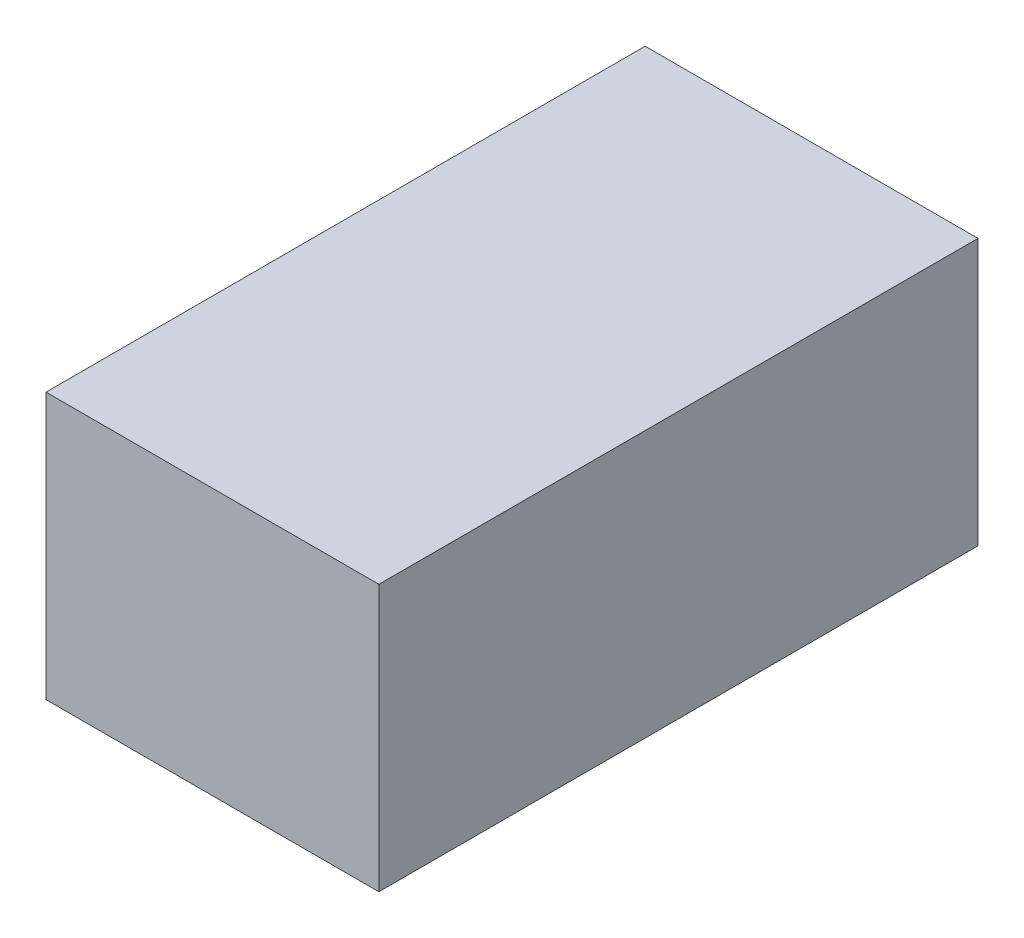
ISO-10303-21;
HEADER;
FILE_DESCRIPTION(('STEP AP214'),'2;1');
FILE_NAME('part.step','',(''),(''),'','','');
FILE_SCHEMA(('AUTOMOTIVE_DESIGN { 1 0 10303 214 1 1 1 1 }'));
ENDSEC;
DATA;
#1=APPLICATION_CONTEXT('core data for automotive mechanical design processes');
#2=APPLICATION_PROTOCOL_DEFINITION('international standard','automotive_design',2000,#1);
#3=PRODUCT_CONTEXT('',#1,'mechanical');
#4=PRODUCT('Part','Part','',(#3));
#5=PRODUCT_RELATED_PRODUCT_CATEGORY('part','',(#4));
#6=PRODUCT_DEFINITION_FORMATION('','',#4);
#7=PRODUCT_DEFINITION_CONTEXT('part definition',#1,'design');
#8=PRODUCT_DEFINITION('design','',#6,#7);
#9=PRODUCT_DEFINITION_SHAPE('','',#8);
#10=(LENGTH_UNIT() NAMED_UNIT(*) SI_UNIT(.MILLI.,.METRE.));
#11=(NAMED_UNIT(*) PLANE_ANGLE_UNIT() SI_UNIT($,.RADIAN.));
#12=(NAMED_UNIT(*) SI_UNIT($,.STERADIAN.) SOLID_ANGLE_UNIT());
#13=UNCERTAINTY_MEASURE_WITH_UNIT(LENGTH_MEASURE(1.E-05),#10,'distance_accuracy_value','');
#14=(GEOMETRIC_REPRESENTATION_CONTEXT(3) GLOBAL_UNCERTAINTY_ASSIGNED_CONTEXT((#13)) GLOBAL_UNIT_ASSIGNED_CONTEXT((#10,
#11,#12)) REPRESENTATION_CONTEXT('',''));
#15=CARTESIAN_POINT('',(0.,0.,0.));
#16=DIRECTION('',(0.,0.,1.));
#17=DIRECTION('',(1.,0.,0.));
#18=AXIS2_PLACEMENT_3D('',#15,#16,#17);
#19=CARTESIAN_POINT('',(0.,0.,54.));
#20=DIRECTION('',(1.,0.,0.));
#21=DIRECTION('',(0.,0.,-1.));
#22=AXIS2_PLACEMENT_3D('',#19,#20,#21);
#23=PLANE('',#22);
#24=DIRECTION('',(0.,-1.,0.));
#25=VECTOR('',#24,1.);
#26=CARTESIAN_POINT('',(0.,0.,0.));
#27=LINE('',#26,#25);
#28=CARTESIAN_POINT('',(0.,24.,0.));
#29=VERTEX_POINT('',#28);
#30=CARTESIAN_POINT('',(0.,0.,0.));
#31=VERTEX_POINT('',#30);
#32=EDGE_CURVE('E104',#29,#31,#27,.T.);
#33=ORIENTED_EDGE('',*,*,#32,.T.);
#34=DIRECTION('',(0.,0.,-1.));
#35=VECTOR('',#34,1.);
#36=CARTESIAN_POINT('',(0.,0.,54.));
#37=LINE('',#36,#35);
#38=CARTESIAN_POINT('',(0.,0.,54.));
#39=VERTEX_POINT('',#38);
#40=EDGE_CURVE('E11',#39,#31,#37,.T.);
#41=ORIENTED_EDGE('',*,*,#40,.F.);
#42=DIRECTION('',(0.,-1.,0.));
#43=VECTOR('',#42,1.);
#44=CARTESIAN_POINT('',(0.,0.,54.));
#45=LINE('',#44,#43);
#46=CARTESIAN_POINT('',(0.,24.,54.));
#47=VERTEX_POINT('',#46);
#48=EDGE_CURVE('E92',#47,#39,#45,.T.);
#49=ORIENTED_EDGE('',*,*,#48,.F.);
#50=DIRECTION('',(0.,0.,-1.));
#51=VECTOR('',#50,1.);
#52=CARTESIAN_POINT('',(0.,24.,54.));
#53=LINE('',#52,#51);
#54=EDGE_CURVE('E100',#47,#29,#53,.T.);
#55=ORIENTED_EDGE('',*,*,#54,.T.);
#56=EDGE_LOOP('',(#33,#41,#49,#55));
#57=FACE_BOUND('',#56,.T.);
#58=ADVANCED_FACE('F41',(#57),#23,.F.);
#59=CARTESIAN_POINT('',(0.,0.,54.));
#60=DIRECTION('',(0.,1.,0.));
#61=DIRECTION('',(0.,0.,1.));
#62=AXIS2_PLACEMENT_3D('',#59,#60,#61);
#63=PLANE('',#62);
#64=DIRECTION('',(1.,0.,0.));
#65=VECTOR('',#64,1.);
#66=CARTESIAN_POINT('',(0.,0.,0.));
#67=LINE('',#66,#65);
#68=CARTESIAN_POINT('',(30.,0.,0.));
#69=VERTEX_POINT('',#68);
#70=EDGE_CURVE('E96',#31,#69,#67,.T.);
#71=ORIENTED_EDGE('',*,*,#70,.T.);
#72=DIRECTION('',(0.,0.,-1.));
#73=VECTOR('',#72,1.);
#74=CARTESIAN_POINT('',(30.,0.,54.));
#75=LINE('',#74,#73);
#76=CARTESIAN_POINT('',(30.,0.,54.));
#77=VERTEX_POINT('',#76);
#78=EDGE_CURVE('E49',#77,#69,#75,.T.);
#79=ORIENTED_EDGE('',*,*,#78,.F.);
#80=DIRECTION('',(1.,0.,0.));
#81=VECTOR('',#80,1.);
#82=CARTESIAN_POINT('',(0.,0.,54.));
#83=LINE('',#82,#81);
#84=EDGE_CURVE('E87',#39,#77,#83,.T.);
#85=ORIENTED_EDGE('',*,*,#84,.F.);
#86=ORIENTED_EDGE('',*,*,#40,.T.);
#87=EDGE_LOOP('',(#71,#79,#85,#86));
#88=FACE_BOUND('',#87,.T.);
#89=ADVANCED_FACE('F95',(#88),#63,.F.);
#90=CARTESIAN_POINT('',(30.,0.,54.));
#91=DIRECTION('',(-1.,0.,0.));
#92=DIRECTION('',(0.,0.,1.));
#93=AXIS2_PLACEMENT_3D('',#90,#91,#92);
#94=PLANE('',#93);
#95=DIRECTION('',(0.,1.,0.));
#96=VECTOR('',#95,1.);
#97=CARTESIAN_POINT('',(30.,0.,0.));
#98=LINE('',#97,#96);
#99=CARTESIAN_POINT('',(30.,24.,0.));
#100=VERTEX_POINT('',#99);
#101=EDGE_CURVE('E74',#69,#100,#98,.T.);
#102=ORIENTED_EDGE('',*,*,#101,.T.);
#103=DIRECTION('',(0.,0.,-1.));
#104=VECTOR('',#103,1.);
#105=CARTESIAN_POINT('',(30.,24.,54.));
#106=LINE('',#105,#104);
#107=CARTESIAN_POINT('',(30.,24.,54.));
#108=VERTEX_POINT('',#107);
#109=EDGE_CURVE('E97',#108,#100,#106,.T.);
#110=ORIENTED_EDGE('',*,*,#109,.F.);
#111=DIRECTION('',(0.,1.,0.));
#112=VECTOR('',#111,1.);
#113=CARTESIAN_POINT('',(30.,0.,54.));
#114=LINE('',#113,#112);
#115=EDGE_CURVE('E90',#77,#108,#114,.T.);
#116=ORIENTED_EDGE('',*,*,#115,.F.);
#117=ORIENTED_EDGE('',*,*,#78,.T.);
#118=EDGE_LOOP('',(#102,#110,#116,#117));
#119=FACE_BOUND('',#118,.T.);
#120=ADVANCED_FACE('F98',(#119),#94,.F.);
#121=CARTESIAN_POINT('',(0.,24.,54.));
#122=DIRECTION('',(0.,-1.,0.));
#123=DIRECTION('',(0.,0.,-1.));
#124=AXIS2_PLACEMENT_3D('',#121,#122,#123);
#125=PLANE('',#124);
#126=DIRECTION('',(-1.,0.,0.));
#127=VECTOR('',#126,1.);
#128=CARTESIAN_POINT('',(0.,24.,0.));
#129=LINE('',#128,#127);
#130=EDGE_CURVE('E80',#100,#29,#129,.T.);
#131=ORIENTED_EDGE('',*,*,#130,.T.);
#132=ORIENTED_EDGE('',*,*,#54,.F.);
#133=DIRECTION('',(-1.,0.,0.));
#134=VECTOR('',#133,1.);
#135=CARTESIAN_POINT('',(0.,24.,54.));
#136=LINE('',#135,#134);
#137=EDGE_CURVE('E57',#108,#47,#136,.T.);
#138=ORIENTED_EDGE('',*,*,#137,.F.);
#139=ORIENTED_EDGE('',*,*,#109,.T.);
#140=EDGE_LOOP('',(#131,#132,#138,#139));
#141=FACE_BOUND('',#140,.T.);
#142=ADVANCED_FACE('F111',(#141),#125,.F.);
#143=CARTESIAN_POINT('',(0.,0.,54.));
#144=DIRECTION('',(0.,0.,-1.));
#145=DIRECTION('',(-1.,0.,0.));
#146=AXIS2_PLACEMENT_3D('',#143,#144,#145);
#147=PLANE('',#146);
#148=ORIENTED_EDGE('',*,*,#48,.T.);
#149=ORIENTED_EDGE('',*,*,#84,.T.);
#150=ORIENTED_EDGE('',*,*,#115,.T.);
#151=ORIENTED_EDGE('',*,*,#137,.T.);
#152=EDGE_LOOP('',(#148,#149,#150,#151));
#153=FACE_BOUND('',#152,.T.);
#154=ADVANCED_FACE('F88',(#153),#147,.F.);
#155=CARTESIAN_POINT('',(0.,0.,0.));
#156=DIRECTION('',(0.,0.,-1.));
#157=DIRECTION('',(-1.,0.,0.));
#158=AXIS2_PLACEMENT_3D('',#155,#156,#157);
#159=PLANE('',#158);
#160=ORIENTED_EDGE('',*,*,#32,.F.);
#161=ORIENTED_EDGE('',*,*,#130,.F.);
#162=ORIENTED_EDGE('',*,*,#101,.F.);
#163=ORIENTED_EDGE('',*,*,#70,.F.);
#164=EDGE_LOOP('',(#160,#161,#162,#163));
#165=FACE_BOUND('',#164,.T.);
#166=ADVANCED_FACE('F114',(#165),#159,.T.);
#167=CLOSED_SHELL('',(#58,#89,#120,#142,#154,#166));
#168=MANIFOLD_SOLID_BREP('B2',#167);
#169=ADVANCED_BREP_SHAPE_REPRESENTATION('',(#18,#168),#14);
#170=SHAPE_DEFINITION_REPRESENTATION(#9,#169);
ENDSEC;
END-ISO-10303-21;
